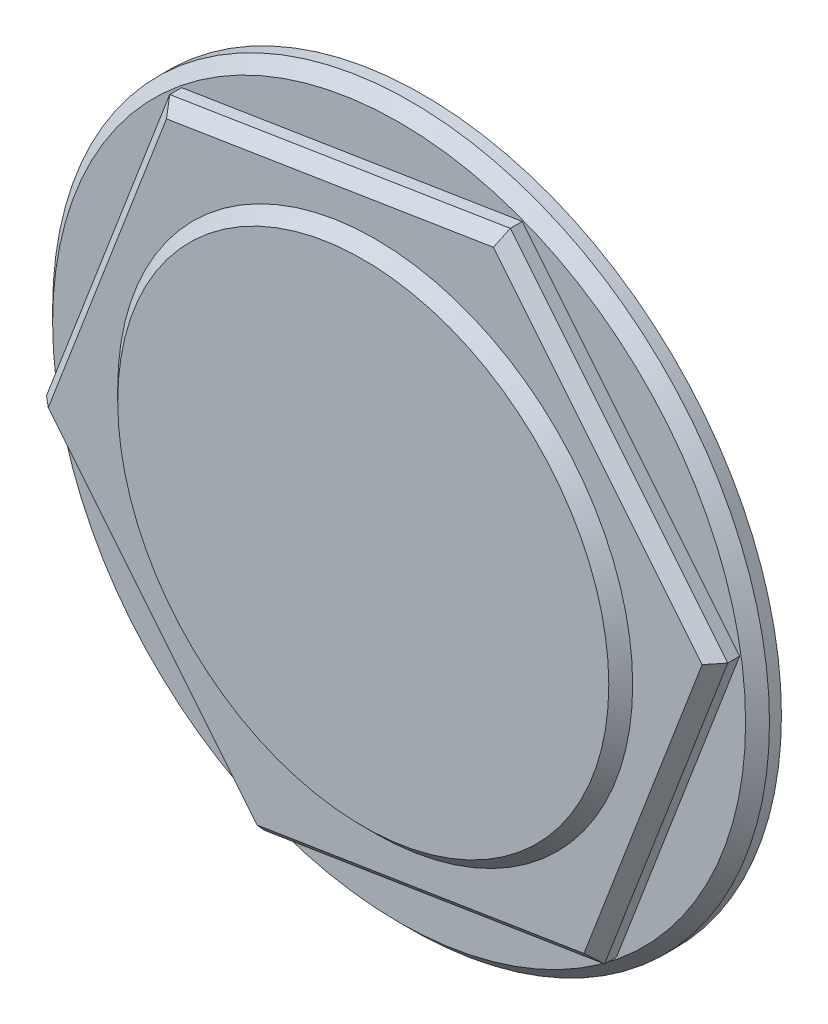
ISO-10303-21;
HEADER;
FILE_DESCRIPTION(('STEP AP214'),'2;1');
FILE_NAME('part.step','',(''),(''),'','','');
FILE_SCHEMA(('AUTOMOTIVE_DESIGN { 1 0 10303 214 1 1 1 1 }'));
ENDSEC;
DATA;
#1=APPLICATION_CONTEXT('core data for automotive mechanical design processes');
#2=APPLICATION_PROTOCOL_DEFINITION('international standard','automotive_design',2000,#1);
#3=PRODUCT_CONTEXT('',#1,'mechanical');
#4=PRODUCT('Part','Part','',(#3));
#5=PRODUCT_RELATED_PRODUCT_CATEGORY('part','',(#4));
#6=PRODUCT_DEFINITION_FORMATION('','',#4);
#7=PRODUCT_DEFINITION_CONTEXT('part definition',#1,'design');
#8=PRODUCT_DEFINITION('design','',#6,#7);
#9=PRODUCT_DEFINITION_SHAPE('','',#8);
#10=(LENGTH_UNIT() NAMED_UNIT(*) SI_UNIT(.MILLI.,.METRE.));
#11=(NAMED_UNIT(*) PLANE_ANGLE_UNIT() SI_UNIT($,.RADIAN.));
#12=(NAMED_UNIT(*) SI_UNIT($,.STERADIAN.) SOLID_ANGLE_UNIT());
#13=UNCERTAINTY_MEASURE_WITH_UNIT(LENGTH_MEASURE(1.E-05),#10,'distance_accuracy_value','');
#14=(GEOMETRIC_REPRESENTATION_CONTEXT(3) GLOBAL_UNCERTAINTY_ASSIGNED_CONTEXT((#13)) GLOBAL_UNIT_ASSIGNED_CONTEXT((#10,
#11,#12)) REPRESENTATION_CONTEXT('',''));
#15=CARTESIAN_POINT('',(0.,0.,0.));
#16=DIRECTION('',(0.,0.,1.));
#17=DIRECTION('',(1.,0.,0.));
#18=AXIS2_PLACEMENT_3D('',#15,#16,#17);
#19=CARTESIAN_POINT('',(-49.3311706629055,19.9456276445698,2.));
#20=DIRECTION('',(0.,0.,-1.));
#21=DIRECTION('',(-1.,0.,0.));
#22=AXIS2_PLACEMENT_3D('',#19,#20,#21);
#23=CYLINDRICAL_SURFACE('',#22,30.);
#24=CARTESIAN_POINT('',(-49.3311706629055,19.9456276445698,1.00000000000001));
#25=DIRECTION('',(0.,0.,1.));
#26=DIRECTION('',(1.,0.,0.));
#27=AXIS2_PLACEMENT_3D('',#24,#25,#26);
#28=CIRCLE('',#27,30.);
#29=CARTESIAN_POINT('',(-19.3311706629055,19.9456276445698,1.00000000000001));
#30=VERTEX_POINT('',#29);
#31=EDGE_CURVE('E11',#30,#30,#28,.F.);
#32=ORIENTED_EDGE('',*,*,#31,.T.);
#33=EDGE_LOOP('',(#32));
#34=FACE_BOUND('',#33,.T.);
#35=CARTESIAN_POINT('',(-49.3311706629055,19.9456276445698,0.));
#36=DIRECTION('',(0.,0.,1.));
#37=DIRECTION('',(1.,0.,0.));
#38=AXIS2_PLACEMENT_3D('',#35,#36,#37);
#39=CIRCLE('',#38,30.);
#40=CARTESIAN_POINT('',(-19.3311706629055,19.9456276445698,0.));
#41=VERTEX_POINT('',#40);
#42=EDGE_CURVE('E146',#41,#41,#39,.T.);
#43=ORIENTED_EDGE('',*,*,#42,.T.);
#44=EDGE_LOOP('',(#43));
#45=FACE_BOUND('',#44,.T.);
#46=ADVANCED_FACE('F32',(#34,#45),#23,.T.);
#47=CARTESIAN_POINT('',(-49.3311706629055,19.9456276445698,2.));
#48=DIRECTION('',(0.,0.,1.));
#49=DIRECTION('',(1.,0.,0.));
#50=AXIS2_PLACEMENT_3D('',#47,#48,#49);
#51=PLANE('',#50);
#52=CARTESIAN_POINT('',(-49.3311706629055,19.9456276445698,2.));
#53=DIRECTION('',(0.,0.,1.));
#54=DIRECTION('',(1.,0.,0.));
#55=AXIS2_PLACEMENT_3D('',#52,#53,#54);
#56=CIRCLE('',#55,29.);
#57=CARTESIAN_POINT('',(-20.3311706629055,19.9456276445698,2.));
#58=VERTEX_POINT('',#57);
#59=EDGE_CURVE('E40',#58,#58,#56,.T.);
#60=ORIENTED_EDGE('',*,*,#59,.T.);
#61=EDGE_LOOP('',(#60));
#62=FACE_BOUND('',#61,.T.);
#63=DIRECTION('',(0.357114005256577,0.934060804899556,0.));
#64=VECTOR('',#63,1.);
#65=CARTESIAN_POINT('',(-31.1341472170734,-2.46422891555053,2.));
#66=LINE('',#65,#64);
#67=CARTESIAN_POINT('',(-31.1341472170734,-2.46422891555053,2.));
#68=VERTEX_POINT('',#67);
#69=CARTESIAN_POINT('',(-20.8251538637599,24.4997839418613,2.));
#70=VERTEX_POINT('',#69);
#71=EDGE_CURVE('E125',#68,#70,#66,.T.);
#72=ORIENTED_EDGE('',*,*,#71,.F.);
#73=DIRECTION('',(0.987477388350644,0.157760601850373,0.));
#74=VECTOR('',#73,1.);
#75=CARTESIAN_POINT('',(-59.640164016219,-7.01838521284202,2.));
#76=LINE('',#75,#74);
#77=CARTESIAN_POINT('',(-59.640164016219,-7.01838521284202,2.));
#78=VERTEX_POINT('',#77);
#79=EDGE_CURVE('E135',#78,#68,#76,.T.);
#80=ORIENTED_EDGE('',*,*,#79,.F.);
#81=DIRECTION('',(0.630363383094067,-0.776300203049183,0.));
#82=VECTOR('',#81,1.);
#83=CARTESIAN_POINT('',(-77.8371874620511,15.3914713472783,2.));
#84=LINE('',#83,#82);
#85=CARTESIAN_POINT('',(-77.8371874620511,15.3914713472783,2.));
#86=VERTEX_POINT('',#85);
#87=EDGE_CURVE('E132',#86,#78,#84,.T.);
#88=ORIENTED_EDGE('',*,*,#87,.F.);
#89=DIRECTION('',(-0.357114005256577,-0.934060804899555,0.));
#90=VECTOR('',#89,1.);
#91=CARTESIAN_POINT('',(-67.5281941087376,42.3554842046902,2.));
#92=LINE('',#91,#90);
#93=CARTESIAN_POINT('',(-67.5281941087376,42.3554842046902,2.));
#94=VERTEX_POINT('',#93);
#95=EDGE_CURVE('E121',#94,#86,#92,.T.);
#96=ORIENTED_EDGE('',*,*,#95,.F.);
#97=DIRECTION('',(-0.987477388350644,-0.157760601850373,0.));
#98=VECTOR('',#97,1.);
#99=CARTESIAN_POINT('',(-39.022177309592,46.9096405019817,2.));
#100=LINE('',#99,#98);
#101=CARTESIAN_POINT('',(-39.022177309592,46.9096405019817,2.));
#102=VERTEX_POINT('',#101);
#103=EDGE_CURVE('E105',#102,#94,#100,.T.);
#104=ORIENTED_EDGE('',*,*,#103,.F.);
#105=DIRECTION('',(-0.630363383094067,0.776300203049183,0.));
#106=VECTOR('',#105,1.);
#107=CARTESIAN_POINT('',(-20.8251538637599,24.4997839418613,2.));
#108=LINE('',#107,#106);
#109=EDGE_CURVE('E117',#70,#102,#108,.T.);
#110=ORIENTED_EDGE('',*,*,#109,.F.);
#111=EDGE_LOOP('',(#72,#80,#88,#96,#104,#110));
#112=FACE_BOUND('',#111,.T.);
#113=ADVANCED_FACE('F116',(#62,#112),#51,.T.);
#114=CARTESIAN_POINT('',(-49.3311706629055,19.9456276445698,0.));
#115=DIRECTION('',(0.,0.,1.));
#116=DIRECTION('',(1.,0.,0.));
#117=AXIS2_PLACEMENT_3D('',#114,#115,#116);
#118=PLANE('',#117);
#119=ORIENTED_EDGE('',*,*,#42,.F.);
#120=EDGE_LOOP('',(#119));
#121=FACE_BOUND('',#120,.T.);
#122=ADVANCED_FACE('F210',(#121),#118,.F.);
#123=CARTESIAN_POINT('',(-31.1341472170734,-2.46422891555053,4.));
#124=DIRECTION('',(-0.934060804899556,0.357114005256577,0.));
#125=DIRECTION('',(-0.357114005256577,-0.934060804899556,0.));
#126=AXIS2_PLACEMENT_3D('',#123,#124,#125);
#127=PLANE('',#126);
#128=DIRECTION('',(0.,0.,-1.));
#129=VECTOR('',#128,1.);
#130=CARTESIAN_POINT('',(-20.8251538637599,24.4997839418613,4.));
#131=LINE('',#130,#129);
#132=CARTESIAN_POINT('',(-20.8251538637599,24.4997839418613,2.99999999999999));
#133=VERTEX_POINT('',#132);
#134=EDGE_CURVE('E109',#133,#70,#131,.T.);
#135=ORIENTED_EDGE('',*,*,#134,.F.);
#136=DIRECTION('',(-0.357114005256577,-0.934060804899556,0.));
#137=VECTOR('',#136,1.);
#138=CARTESIAN_POINT('',(-31.1341472170734,-2.46422891555052,2.99999999999999));
#139=LINE('',#138,#137);
#140=CARTESIAN_POINT('',(-31.1341472170734,-2.46422891555053,2.99999999999999));
#141=VERTEX_POINT('',#140);
#142=EDGE_CURVE('E163',#133,#141,#139,.T.);
#143=ORIENTED_EDGE('',*,*,#142,.T.);
#144=DIRECTION('',(0.,0.,-1.));
#145=VECTOR('',#144,1.);
#146=CARTESIAN_POINT('',(-31.1341472170734,-2.46422891555053,4.));
#147=LINE('',#146,#145);
#148=EDGE_CURVE('E138',#141,#68,#147,.T.);
#149=ORIENTED_EDGE('',*,*,#148,.T.);
#150=ORIENTED_EDGE('',*,*,#71,.T.);
#151=EDGE_LOOP('',(#135,#143,#149,#150));
#152=FACE_BOUND('',#151,.T.);
#153=ADVANCED_FACE('F253',(#152),#127,.F.);
#154=CARTESIAN_POINT('',(-20.8251538637599,24.4997839418613,4.));
#155=DIRECTION('',(-0.776300203049183,-0.630363383094067,0.));
#156=DIRECTION('',(0.630363383094067,-0.776300203049183,0.));
#157=AXIS2_PLACEMENT_3D('',#154,#155,#156);
#158=PLANE('',#157);
#159=DIRECTION('',(0.,0.,-1.));
#160=VECTOR('',#159,1.);
#161=CARTESIAN_POINT('',(-39.022177309592,46.9096405019817,4.));
#162=LINE('',#161,#160);
#163=CARTESIAN_POINT('',(-39.022177309592,46.9096405019817,2.99999999999999));
#164=VERTEX_POINT('',#163);
#165=EDGE_CURVE('E102',#164,#102,#162,.T.);
#166=ORIENTED_EDGE('',*,*,#165,.F.);
#167=DIRECTION('',(0.630363383094067,-0.776300203049183,0.));
#168=VECTOR('',#167,1.);
#169=CARTESIAN_POINT('',(-20.8251538637599,24.4997839418613,2.99999999999999));
#170=LINE('',#169,#168);
#171=EDGE_CURVE('E172',#164,#133,#170,.T.);
#172=ORIENTED_EDGE('',*,*,#171,.T.);
#173=ORIENTED_EDGE('',*,*,#134,.T.);
#174=ORIENTED_EDGE('',*,*,#109,.T.);
#175=EDGE_LOOP('',(#166,#172,#173,#174));
#176=FACE_BOUND('',#175,.T.);
#177=ADVANCED_FACE('F123',(#176),#158,.F.);
#178=CARTESIAN_POINT('',(-39.022177309592,46.9096405019817,4.));
#179=DIRECTION('',(0.157760601850373,-0.987477388350644,0.));
#180=DIRECTION('',(0.987477388350644,0.157760601850373,0.));
#181=AXIS2_PLACEMENT_3D('',#178,#179,#180);
#182=PLANE('',#181);
#183=DIRECTION('',(0.,0.,-1.));
#184=VECTOR('',#183,1.);
#185=CARTESIAN_POINT('',(-67.5281941087376,42.3554842046902,4.));
#186=LINE('',#185,#184);
#187=CARTESIAN_POINT('',(-67.5281941087376,42.3554842046902,2.99999999999999));
#188=VERTEX_POINT('',#187);
#189=EDGE_CURVE('E110',#188,#94,#186,.T.);
#190=ORIENTED_EDGE('',*,*,#189,.F.);
#191=DIRECTION('',(0.987477388350644,0.157760601850373,0.));
#192=VECTOR('',#191,1.);
#193=CARTESIAN_POINT('',(-39.022177309592,46.9096405019817,2.99999999999999));
#194=LINE('',#193,#192);
#195=EDGE_CURVE('E47',#188,#164,#194,.T.);
#196=ORIENTED_EDGE('',*,*,#195,.T.);
#197=ORIENTED_EDGE('',*,*,#165,.T.);
#198=ORIENTED_EDGE('',*,*,#103,.T.);
#199=EDGE_LOOP('',(#190,#196,#197,#198));
#200=FACE_BOUND('',#199,.T.);
#201=ADVANCED_FACE('F104',(#200),#182,.F.);
#202=CARTESIAN_POINT('',(-67.5281941087376,42.3554842046902,4.));
#203=DIRECTION('',(0.934060804899556,-0.357114005256577,0.));
#204=DIRECTION('',(0.357114005256577,0.934060804899556,0.));
#205=AXIS2_PLACEMENT_3D('',#202,#203,#204);
#206=PLANE('',#205);
#207=DIRECTION('',(0.,0.,-1.));
#208=VECTOR('',#207,1.);
#209=CARTESIAN_POINT('',(-77.8371874620511,15.3914713472783,4.));
#210=LINE('',#209,#208);
#211=CARTESIAN_POINT('',(-77.8371874620511,15.3914713472783,2.99999999999999));
#212=VERTEX_POINT('',#211);
#213=EDGE_CURVE('E142',#212,#86,#210,.T.);
#214=ORIENTED_EDGE('',*,*,#213,.F.);
#215=DIRECTION('',(0.357114005256577,0.934060804899556,0.));
#216=VECTOR('',#215,1.);
#217=CARTESIAN_POINT('',(-67.5281941087376,42.3554842046902,2.99999999999999));
#218=LINE('',#217,#216);
#219=EDGE_CURVE('E55',#212,#188,#218,.T.);
#220=ORIENTED_EDGE('',*,*,#219,.T.);
#221=ORIENTED_EDGE('',*,*,#189,.T.);
#222=ORIENTED_EDGE('',*,*,#95,.T.);
#223=EDGE_LOOP('',(#214,#220,#221,#222));
#224=FACE_BOUND('',#223,.T.);
#225=ADVANCED_FACE('F283',(#224),#206,.F.);
#226=CARTESIAN_POINT('',(-77.8371874620511,15.3914713472783,4.));
#227=DIRECTION('',(0.776300203049183,0.630363383094067,0.));
#228=DIRECTION('',(-0.630363383094067,0.776300203049183,0.));
#229=AXIS2_PLACEMENT_3D('',#226,#227,#228);
#230=PLANE('',#229);
#231=DIRECTION('',(0.,0.,-1.));
#232=VECTOR('',#231,1.);
#233=CARTESIAN_POINT('',(-59.640164016219,-7.01838521284202,4.));
#234=LINE('',#233,#232);
#235=CARTESIAN_POINT('',(-59.640164016219,-7.01838521284202,2.99999999999999));
#236=VERTEX_POINT('',#235);
#237=EDGE_CURVE('E140',#236,#78,#234,.T.);
#238=ORIENTED_EDGE('',*,*,#237,.F.);
#239=DIRECTION('',(-0.630363383094067,0.776300203049183,0.));
#240=VECTOR('',#239,1.);
#241=CARTESIAN_POINT('',(-77.8371874620511,15.3914713472783,2.99999999999999));
#242=LINE('',#241,#240);
#243=EDGE_CURVE('E168',#236,#212,#242,.T.);
#244=ORIENTED_EDGE('',*,*,#243,.T.);
#245=ORIENTED_EDGE('',*,*,#213,.T.);
#246=ORIENTED_EDGE('',*,*,#87,.T.);
#247=EDGE_LOOP('',(#238,#244,#245,#246));
#248=FACE_BOUND('',#247,.T.);
#249=ADVANCED_FACE('F266',(#248),#230,.F.);
#250=CARTESIAN_POINT('',(-59.640164016219,-7.01838521284202,4.));
#251=DIRECTION('',(-0.157760601850373,0.987477388350644,0.));
#252=DIRECTION('',(-0.987477388350644,-0.157760601850373,0.));
#253=AXIS2_PLACEMENT_3D('',#250,#251,#252);
#254=PLANE('',#253);
#255=ORIENTED_EDGE('',*,*,#148,.F.);
#256=DIRECTION('',(-0.987477388350644,-0.157760601850373,0.));
#257=VECTOR('',#256,1.);
#258=CARTESIAN_POINT('',(-59.640164016219,-7.01838521284202,2.99999999999999));
#259=LINE('',#258,#257);
#260=EDGE_CURVE('E166',#141,#236,#259,.T.);
#261=ORIENTED_EDGE('',*,*,#260,.T.);
#262=ORIENTED_EDGE('',*,*,#237,.T.);
#263=ORIENTED_EDGE('',*,*,#79,.T.);
#264=EDGE_LOOP('',(#255,#261,#262,#263));
#265=FACE_BOUND('',#264,.T.);
#266=ADVANCED_FACE('F262',(#265),#254,.F.);
#267=CARTESIAN_POINT('',(0.,0.,4.));
#268=DIRECTION('',(0.,0.,1.));
#269=DIRECTION('',(1.,0.,0.));
#270=AXIS2_PLACEMENT_3D('',#267,#268,#269);
#271=PLANE('',#270);
#272=DIRECTION('',(0.987477388350644,0.157760601850373,0.));
#273=VECTOR('',#272,1.);
#274=CARTESIAN_POINT('',(-31.2919078189238,-1.47675152719987,4.));
#275=LINE('',#274,#273);
#276=CARTESIAN_POINT('',(-59.2278042820865,-5.93982469854554,4.));
#277=VERTEX_POINT('',#276);
#278=CARTESIAN_POINT('',(-31.8620281549067,-1.5678346531457,4.));
#279=VERTEX_POINT('',#278);
#280=EDGE_CURVE('E158',#277,#279,#275,.T.);
#281=ORIENTED_EDGE('',*,*,#280,.T.);
#282=DIRECTION('',(0.357114005256577,0.934060804899556,0.));
#283=VECTOR('',#282,1.);
#284=CARTESIAN_POINT('',(-21.7592146686594,24.8568979471179,4.));
#285=LINE('',#284,#283);
#286=CARTESIAN_POINT('',(-21.9653945357257,24.3176176899697,4.));
#287=VERTEX_POINT('',#286);
#288=EDGE_CURVE('E160',#279,#287,#285,.T.);
#289=ORIENTED_EDGE('',*,*,#288,.T.);
#290=DIRECTION('',(-0.630363383094067,0.776300203049183,0.));
#291=VECTOR('',#290,1.);
#292=CARTESIAN_POINT('',(-39.7984775126412,46.2792771188876,4.));
#293=LINE('',#292,#291);
#294=CARTESIAN_POINT('',(-39.4345370437246,45.8310799876852,4.));
#295=VERTEX_POINT('',#294);
#296=EDGE_CURVE('E150',#287,#295,#293,.T.);
#297=ORIENTED_EDGE('',*,*,#296,.T.);
#298=DIRECTION('',(-0.987477388350644,-0.157760601850373,0.));
#299=VECTOR('',#298,1.);
#300=CARTESIAN_POINT('',(-67.3704335068873,41.3680068163395,4.));
#301=LINE('',#300,#299);
#302=CARTESIAN_POINT('',(-66.8003131709044,41.4590899422853,4.));
#303=VERTEX_POINT('',#302);
#304=EDGE_CURVE('E152',#295,#303,#301,.T.);
#305=ORIENTED_EDGE('',*,*,#304,.T.);
#306=DIRECTION('',(-0.357114005256577,-0.934060804899556,0.));
#307=VECTOR('',#306,1.);
#308=CARTESIAN_POINT('',(-76.9031266571516,15.0343573420218,4.));
#309=LINE('',#308,#307);
#310=CARTESIAN_POINT('',(-76.6969467900853,15.57363759917,4.));
#311=VERTEX_POINT('',#310);
#312=EDGE_CURVE('E154',#303,#311,#309,.T.);
#313=ORIENTED_EDGE('',*,*,#312,.T.);
#314=DIRECTION('',(0.630363383094067,-0.776300203049183,0.));
#315=VECTOR('',#314,1.);
#316=CARTESIAN_POINT('',(-58.8638638131698,-6.38802182974795,4.));
#317=LINE('',#316,#315);
#318=EDGE_CURVE('E156',#311,#277,#317,.T.);
#319=ORIENTED_EDGE('',*,*,#318,.T.);
#320=EDGE_LOOP('',(#281,#289,#297,#305,#313,#319));
#321=FACE_BOUND('',#320,.T.);
#322=CARTESIAN_POINT('',(-49.3311706629055,19.9456276445698,4.));
#323=DIRECTION('',(0.,0.,1.));
#324=DIRECTION('',(1.,0.,0.));
#325=AXIS2_PLACEMENT_3D('',#322,#323,#324);
#326=CIRCLE('',#325,21.5497881954906);
#327=CARTESIAN_POINT('',(-27.7813824674149,19.9456276445698,4.));
#328=VERTEX_POINT('',#327);
#329=EDGE_CURVE('E149',#328,#328,#326,.T.);
#330=ORIENTED_EDGE('',*,*,#329,.F.);
#331=EDGE_LOOP('',(#330));
#332=FACE_BOUND('',#331,.T.);
#333=ADVANCED_FACE('F241',(#321,#332),#271,.T.);
#334=CARTESIAN_POINT('',(-49.3311706629055,19.9456276445698,5.));
#335=DIRECTION('',(0.,0.,1.));
#336=DIRECTION('',(1.,0.,0.));
#337=AXIS2_PLACEMENT_3D('',#334,#335,#336);
#338=PLANE('',#337);
#339=CARTESIAN_POINT('',(-49.3311706629055,19.9456276445698,5.));
#340=DIRECTION('',(0.,0.,1.));
#341=DIRECTION('',(1.,0.,0.));
#342=AXIS2_PLACEMENT_3D('',#339,#340,#341);
#343=CIRCLE('',#342,20.5497881954906);
#344=CARTESIAN_POINT('',(-28.7813824674149,19.9456276445698,5.));
#345=VERTEX_POINT('',#344);
#346=EDGE_CURVE('E174',#345,#345,#343,.T.);
#347=ORIENTED_EDGE('',*,*,#346,.T.);
#348=EDGE_LOOP('',(#347));
#349=FACE_BOUND('',#348,.T.);
#350=ADVANCED_FACE('F236',(#349),#338,.T.);
#351=CARTESIAN_POINT('',(-72.1105925484872,27.569621154572,4.));
#352=DIRECTION('',(-0.660480729185043,0.252517734773615,0.707106781186545));
#353=DIRECTION('',(0.357114005256577,0.934060804899556,0.));
#354=AXIS2_PLACEMENT_3D('',#351,#352,#353);
#355=PLANE('',#354);
#356=DIRECTION('',(0.476509927790919,-0.586827794284885,0.654653670707978));
#357=VECTOR('',#356,1.);
#358=CARTESIAN_POINT('',(-56.0979698275162,28.2790234387482,18.7034257762628));
#359=LINE('',#358,#357);
#360=EDGE_CURVE('E185',#188,#303,#359,.T.);
#361=ORIENTED_EDGE('',*,*,#360,.F.);
#362=ORIENTED_EDGE('',*,*,#219,.F.);
#363=DIRECTION('',(0.746462741392956,0.119255805479989,0.65465367070798));
#364=VECTOR('',#363,1.);
#365=CARTESIAN_POINT('',(-73.0735171834689,16.152521168805,7.17777614472347));
#366=LINE('',#365,#364);
#367=EDGE_CURVE('E127',#311,#212,#366,.F.);
#368=ORIENTED_EDGE('',*,*,#367,.F.);
#369=ORIENTED_EDGE('',*,*,#312,.F.);
#370=EDGE_LOOP('',(#361,#362,#368,#369));
#371=FACE_BOUND('',#370,.T.);
#372=ADVANCED_FACE('F233',(#371),#355,.T.);
#373=CARTESIAN_POINT('',(-38.5998232157857,-31.3434352503886,4.));
#374=DIRECTION('',(-0.548927137812573,-0.44573422279751,0.707106781186545));
#375=DIRECTION('',(-0.630363383094067,0.776300203049183,0.));
#376=AXIS2_PLACEMENT_3D('',#373,#374,#375);
#377=PLANE('',#376);
#378=ORIENTED_EDGE('',*,*,#367,.T.);
#379=ORIENTED_EDGE('',*,*,#243,.F.);
#380=DIRECTION('',(0.269952813602027,0.706083599764871,0.654653670707978));
#381=VECTOR('',#380,1.);
#382=CARTESIAN_POINT('',(-62.5667132971128,-14.6730135294378,-4.09707820296827));
#383=LINE('',#382,#381);
#384=EDGE_CURVE('E182',#277,#236,#383,.F.);
#385=ORIENTED_EDGE('',*,*,#384,.F.);
#386=ORIENTED_EDGE('',*,*,#318,.F.);
#387=EDGE_LOOP('',(#378,#379,#385,#386));
#388=FACE_BOUND('',#387,.T.);
#389=ADVANCED_FACE('F229',(#388),#377,.T.);
#390=CARTESIAN_POINT('',(-8.12125886526398,50.8337278149871,4.));
#391=DIRECTION('',(-0.111553591372469,0.698251957571121,0.707106781186549));
#392=DIRECTION('',(0.987477388350644,0.157760601850373,0.));
#393=AXIS2_PLACEMENT_3D('',#390,#391,#392);
#394=PLANE('',#393);
#395=ORIENTED_EDGE('',*,*,#360,.T.);
#396=ORIENTED_EDGE('',*,*,#304,.F.);
#397=DIRECTION('',(-0.269952813602033,-0.706083599764872,0.654653670707976));
#398=VECTOR('',#397,1.);
#399=CARTESIAN_POINT('',(-45.6010556642312,29.7020476301886,18.954221060111));
#400=LINE('',#399,#398);
#401=EDGE_CURVE('E179',#164,#295,#400,.T.);
#402=ORIENTED_EDGE('',*,*,#401,.F.);
#403=ORIENTED_EDGE('',*,*,#195,.F.);
#404=EDGE_LOOP('',(#395,#396,#402,#403));
#405=FACE_BOUND('',#404,.T.);
#406=ADVANCED_FACE('F225',(#405),#394,.T.);
#407=CARTESIAN_POINT('',(-0.548749976446094,3.43481317415617,4.));
#408=DIRECTION('',(0.111553591372469,-0.698251957571122,0.707106781186548));
#409=DIRECTION('',(-0.987477388350644,-0.157760601850373,0.));
#410=AXIS2_PLACEMENT_3D('',#407,#408,#409);
#411=PLANE('',#410);
#412=ORIENTED_EDGE('',*,*,#384,.T.);
#413=ORIENTED_EDGE('',*,*,#260,.F.);
#414=DIRECTION('',(-0.476509927790922,0.586827794284883,0.654653670707978));
#415=VECTOR('',#414,1.);
#416=CARTESIAN_POINT('',(-26.1508683852323,-8.60119764304989,-3.84628291912012));
#417=LINE('',#416,#415);
#418=EDGE_CURVE('E177',#279,#141,#417,.F.);
#419=ORIENTED_EDGE('',*,*,#418,.F.);
#420=ORIENTED_EDGE('',*,*,#280,.F.);
#421=EDGE_LOOP('',(#412,#413,#419,#420));
#422=FACE_BOUND('',#421,.T.);
#423=ADVANCED_FACE('F221',(#422),#411,.T.);
#424=CARTESIAN_POINT('',(-1.33741346942499,-1.08599286187344,4.));
#425=DIRECTION('',(0.54892713781257,0.445734222797507,0.707106781186549));
#426=DIRECTION('',(0.630363383094067,-0.776300203049183,0.));
#427=AXIS2_PLACEMENT_3D('',#424,#425,#426);
#428=PLANE('',#427);
#429=ORIENTED_EDGE('',*,*,#401,.T.);
#430=ORIENTED_EDGE('',*,*,#296,.F.);
#431=DIRECTION('',(0.746462741392957,0.119255805479995,-0.654653670707977));
#432=VECTOR('',#431,1.);
#433=CARTESIAN_POINT('',(-12.7327766446136,25.7926320774781,-4.09707820296806));
#434=LINE('',#433,#432);
#435=EDGE_CURVE('E175',#133,#287,#434,.F.);
#436=ORIENTED_EDGE('',*,*,#435,.F.);
#437=ORIENTED_EDGE('',*,*,#171,.F.);
#438=EDGE_LOOP('',(#429,#430,#436,#437));
#439=FACE_BOUND('',#438,.T.);
#440=ADVANCED_FACE('F217',(#439),#428,.T.);
#441=CARTESIAN_POINT('',(-27.2756739133085,10.4281489022563,4.));
#442=DIRECTION('',(0.660480729185042,-0.252517734773614,0.707106781186546));
#443=DIRECTION('',(-0.357114005256577,-0.934060804899556,0.));
#444=AXIS2_PLACEMENT_3D('',#441,#442,#443);
#445=PLANE('',#444);
#446=ORIENTED_EDGE('',*,*,#418,.T.);
#447=ORIENTED_EDGE('',*,*,#142,.F.);
#448=ORIENTED_EDGE('',*,*,#435,.T.);
#449=ORIENTED_EDGE('',*,*,#288,.F.);
#450=EDGE_LOOP('',(#446,#447,#448,#449));
#451=FACE_BOUND('',#450,.T.);
#452=ADVANCED_FACE('F201',(#451),#445,.T.);
#453=CARTESIAN_POINT('',(-49.3311706629055,19.9456276445698,5.));
#454=DIRECTION('',(0.,0.,-1.));
#455=DIRECTION('',(-1.,0.,0.));
#456=AXIS2_PLACEMENT_3D('',#453,#454,#455);
#457=CONICAL_SURFACE('',#456,20.5497881954906,0.78539816339744);
#458=ORIENTED_EDGE('',*,*,#329,.T.);
#459=EDGE_LOOP('',(#458));
#460=FACE_BOUND('',#459,.T.);
#461=ORIENTED_EDGE('',*,*,#346,.F.);
#462=EDGE_LOOP('',(#461));
#463=FACE_BOUND('',#462,.T.);
#464=ADVANCED_FACE('F196',(#460,#463),#457,.T.);
#465=CARTESIAN_POINT('',(-49.3311706629055,19.9456276445698,2.));
#466=DIRECTION('',(0.,0.,-1.));
#467=DIRECTION('',(-1.,0.,0.));
#468=AXIS2_PLACEMENT_3D('',#465,#466,#467);
#469=CONICAL_SURFACE('',#468,29.,0.785398163397454);
#470=ORIENTED_EDGE('',*,*,#31,.F.);
#471=EDGE_LOOP('',(#470));
#472=FACE_BOUND('',#471,.T.);
#473=ORIENTED_EDGE('',*,*,#59,.F.);
#474=EDGE_LOOP('',(#473));
#475=FACE_BOUND('',#474,.T.);
#476=ADVANCED_FACE('F34',(#472,#475),#469,.T.);
#477=CLOSED_SHELL('',(#46,#113,#122,#153,#177,#201,#225,#249,#266,#333,#350,#372,#389,#406,#423,
#440,#452,#464,#476));
#478=MANIFOLD_SOLID_BREP('B2',#477);
#479=ADVANCED_BREP_SHAPE_REPRESENTATION('',(#18,#478),#14);
#480=SHAPE_DEFINITION_REPRESENTATION(#9,#479);
ENDSEC;
END-ISO-10303-21;
